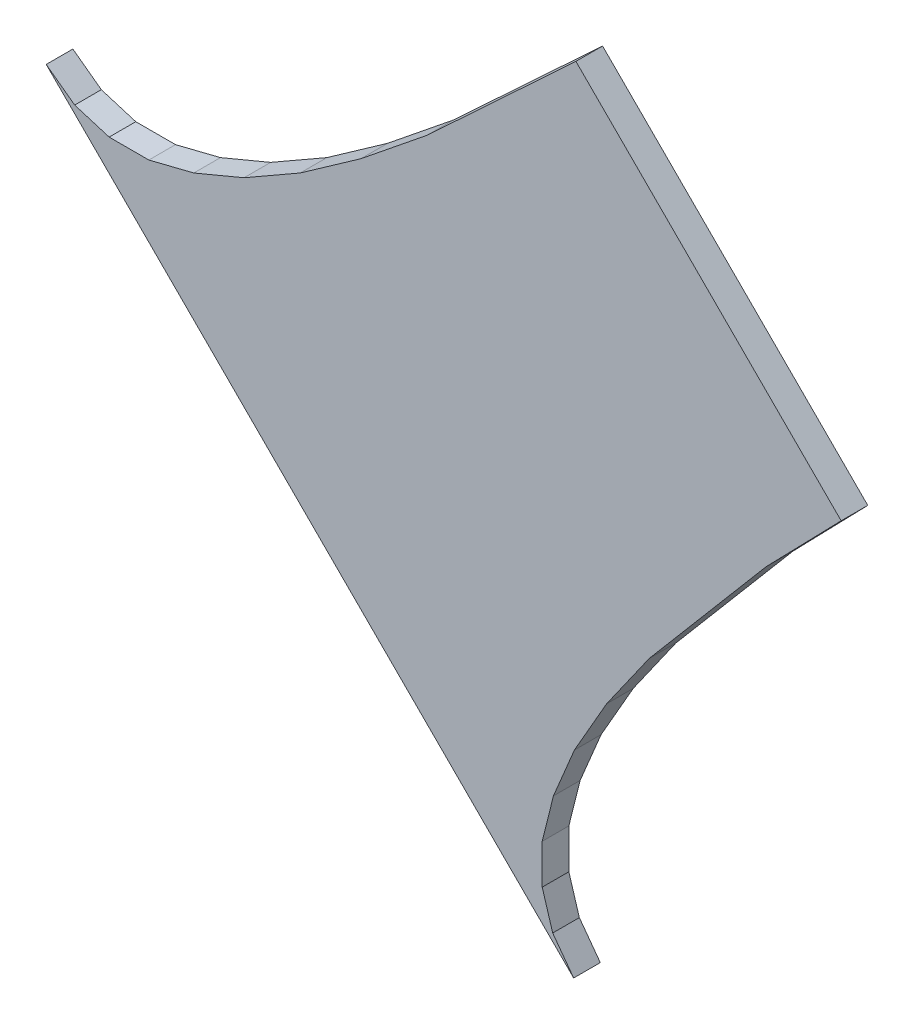
ISO-10303-21;
HEADER;
FILE_DESCRIPTION(('STEP AP214'),'2;1');
FILE_NAME('part.step','',(''),(''),'','','');
FILE_SCHEMA(('AUTOMOTIVE_DESIGN { 1 0 10303 214 1 1 1 1 }'));
ENDSEC;
DATA;
#1=APPLICATION_CONTEXT('core data for automotive mechanical design processes');
#2=APPLICATION_PROTOCOL_DEFINITION('international standard','automotive_design',2000,#1);
#3=PRODUCT_CONTEXT('',#1,'mechanical');
#4=PRODUCT('Part','Part','',(#3));
#5=PRODUCT_RELATED_PRODUCT_CATEGORY('part','',(#4));
#6=PRODUCT_DEFINITION_FORMATION('','',#4);
#7=PRODUCT_DEFINITION_CONTEXT('part definition',#1,'design');
#8=PRODUCT_DEFINITION('design','',#6,#7);
#9=PRODUCT_DEFINITION_SHAPE('','',#8);
#10=(LENGTH_UNIT() NAMED_UNIT(*) SI_UNIT(.MILLI.,.METRE.));
#11=(NAMED_UNIT(*) PLANE_ANGLE_UNIT() SI_UNIT($,.RADIAN.));
#12=(NAMED_UNIT(*) SI_UNIT($,.STERADIAN.) SOLID_ANGLE_UNIT());
#13=UNCERTAINTY_MEASURE_WITH_UNIT(LENGTH_MEASURE(1.E-05),#10,'distance_accuracy_value','');
#14=(GEOMETRIC_REPRESENTATION_CONTEXT(3) GLOBAL_UNCERTAINTY_ASSIGNED_CONTEXT((#13)) GLOBAL_UNIT_ASSIGNED_CONTEXT((#10,
#11,#12)) REPRESENTATION_CONTEXT('',''));
#15=CARTESIAN_POINT('',(0.,0.,0.));
#16=DIRECTION('',(0.,0.,1.));
#17=DIRECTION('',(1.,0.,0.));
#18=AXIS2_PLACEMENT_3D('',#15,#16,#17);
#19=CARTESIAN_POINT('',(40.2470016479492,102.280998229981,0.));
#20=DIRECTION('',(0.680867255825872,-0.732406840454229,0.));
#21=DIRECTION('',(-0.732406840454229,-0.680867255825872,0.));
#22=AXIS2_PLACEMENT_3D('',#19,#20,#21);
#23=PLANE('',#22);
#24=DIRECTION('',(-0.732406840454229,-0.680867255825872,0.));
#25=VECTOR('',#24,1.);
#26=CARTESIAN_POINT('',(40.2470016479492,102.280998229981,0.03556));
#27=LINE('',#26,#25);
#28=CARTESIAN_POINT('',(40.2470016479492,102.280998229981,0.03556));
#29=VERTEX_POINT('',#28);
#30=CARTESIAN_POINT('',(40.0480003356934,102.096000671387,0.03556));
#31=VERTEX_POINT('',#30);
#32=EDGE_CURVE('E11',#29,#31,#27,.T.);
#33=ORIENTED_EDGE('',*,*,#32,.F.);
#34=DIRECTION('',(0.,0.,1.));
#35=VECTOR('',#34,1.);
#36=CARTESIAN_POINT('',(40.2470016479492,102.280998229981,0.));
#37=LINE('',#36,#35);
#38=CARTESIAN_POINT('',(40.2470016479492,102.280998229981,0.));
#39=VERTEX_POINT('',#38);
#40=EDGE_CURVE('E24',#39,#29,#37,.T.);
#41=ORIENTED_EDGE('',*,*,#40,.F.);
#42=DIRECTION('',(-0.732406840454229,-0.680867255825872,0.));
#43=VECTOR('',#42,1.);
#44=CARTESIAN_POINT('',(40.2470016479492,102.280998229981,0.));
#45=LINE('',#44,#43);
#46=CARTESIAN_POINT('',(40.0480003356934,102.096000671387,0.));
#47=VERTEX_POINT('',#46);
#48=EDGE_CURVE('E172',#39,#47,#45,.T.);
#49=ORIENTED_EDGE('',*,*,#48,.T.);
#50=DIRECTION('',(0.,0.,1.));
#51=VECTOR('',#50,1.);
#52=CARTESIAN_POINT('',(40.0480003356934,102.096000671387,0.));
#53=LINE('',#52,#51);
#54=EDGE_CURVE('E37',#47,#31,#53,.T.);
#55=ORIENTED_EDGE('',*,*,#54,.T.);
#56=EDGE_LOOP('',(#33,#41,#49,#55));
#57=FACE_BOUND('',#56,.T.);
#58=ADVANCED_FACE('F17',(#57),#23,.F.);
#59=CARTESIAN_POINT('',(40.0480003356934,102.096000671387,0.));
#60=DIRECTION('',(0.627915315848081,-0.778281668885632,0.));
#61=DIRECTION('',(-0.778281668885632,-0.627915315848081,0.));
#62=AXIS2_PLACEMENT_3D('',#59,#60,#61);
#63=PLANE('',#62);
#64=DIRECTION('',(-0.778281668885632,-0.627915315848081,0.));
#65=VECTOR('',#64,1.);
#66=CARTESIAN_POINT('',(40.0480003356934,102.096000671387,0.03556));
#67=LINE('',#66,#65);
#68=CARTESIAN_POINT('',(39.9599990844727,102.025001525879,0.03556));
#69=VERTEX_POINT('',#68);
#70=EDGE_CURVE('E308',#31,#69,#67,.T.);
#71=ORIENTED_EDGE('',*,*,#70,.F.);
#72=ORIENTED_EDGE('',*,*,#54,.F.);
#73=DIRECTION('',(-0.778281668885632,-0.627915315848081,0.));
#74=VECTOR('',#73,1.);
#75=CARTESIAN_POINT('',(40.0480003356934,102.096000671387,0.));
#76=LINE('',#75,#74);
#77=CARTESIAN_POINT('',(39.9599990844727,102.025001525879,0.));
#78=VERTEX_POINT('',#77);
#79=EDGE_CURVE('E305',#47,#78,#76,.T.);
#80=ORIENTED_EDGE('',*,*,#79,.T.);
#81=DIRECTION('',(0.,0.,1.));
#82=VECTOR('',#81,1.);
#83=CARTESIAN_POINT('',(39.9599990844727,102.025001525879,0.));
#84=LINE('',#83,#82);
#85=EDGE_CURVE('E303',#78,#69,#84,.T.);
#86=ORIENTED_EDGE('',*,*,#85,.T.);
#87=EDGE_LOOP('',(#71,#72,#80,#86));
#88=FACE_BOUND('',#87,.T.);
#89=ADVANCED_FACE('F316',(#88),#63,.F.);
#90=CARTESIAN_POINT('',(39.9599990844727,102.025001525879,0.));
#91=DIRECTION('',(0.575500084548328,-0.817801719663677,0.));
#92=DIRECTION('',(-0.817801719663677,-0.575500084548328,0.));
#93=AXIS2_PLACEMENT_3D('',#90,#91,#92);
#94=PLANE('',#93);
#95=DIRECTION('',(-0.817801719663677,-0.575500084548328,0.));
#96=VECTOR('',#95,1.);
#97=CARTESIAN_POINT('',(39.9599990844727,102.025001525879,0.03556));
#98=LINE('',#97,#96);
#99=CARTESIAN_POINT('',(39.8790016174316,101.968002319336,0.03556));
#100=VERTEX_POINT('',#99);
#101=EDGE_CURVE('E300',#69,#100,#98,.T.);
#102=ORIENTED_EDGE('',*,*,#101,.F.);
#103=ORIENTED_EDGE('',*,*,#85,.F.);
#104=DIRECTION('',(-0.817801719663677,-0.575500084548328,0.));
#105=VECTOR('',#104,1.);
#106=CARTESIAN_POINT('',(39.9599990844727,102.025001525879,0.));
#107=LINE('',#106,#105);
#108=CARTESIAN_POINT('',(39.8790016174316,101.968002319336,0.));
#109=VERTEX_POINT('',#108);
#110=EDGE_CURVE('E297',#78,#109,#107,.T.);
#111=ORIENTED_EDGE('',*,*,#110,.T.);
#112=DIRECTION('',(0.,0.,1.));
#113=VECTOR('',#112,1.);
#114=CARTESIAN_POINT('',(39.8790016174316,101.968002319336,0.));
#115=LINE('',#114,#113);
#116=EDGE_CURVE('E295',#109,#100,#115,.T.);
#117=ORIENTED_EDGE('',*,*,#116,.T.);
#118=EDGE_LOOP('',(#102,#103,#111,#117));
#119=FACE_BOUND('',#118,.T.);
#120=ADVANCED_FACE('F322',(#119),#94,.F.);
#121=CARTESIAN_POINT('',(39.8790016174317,101.968002319336,0.));
#122=DIRECTION('',(0.49737392841794,-0.867536267443676,0.));
#123=DIRECTION('',(-0.867536267443676,-0.49737392841794,0.));
#124=AXIS2_PLACEMENT_3D('',#121,#122,#123);
#125=PLANE('',#124);
#126=DIRECTION('',(-0.867536267443676,-0.49737392841794,0.));
#127=VECTOR('',#126,1.);
#128=CARTESIAN_POINT('',(39.8790016174316,101.968002319336,0.03556));
#129=LINE('',#128,#127);
#130=CARTESIAN_POINT('',(39.8040008544922,101.925003051758,0.03556));
#131=VERTEX_POINT('',#130);
#132=EDGE_CURVE('E292',#100,#131,#129,.T.);
#133=ORIENTED_EDGE('',*,*,#132,.F.);
#134=ORIENTED_EDGE('',*,*,#116,.F.);
#135=DIRECTION('',(-0.867536267443676,-0.49737392841794,0.));
#136=VECTOR('',#135,1.);
#137=CARTESIAN_POINT('',(39.8790016174316,101.968002319336,0.));
#138=LINE('',#137,#136);
#139=CARTESIAN_POINT('',(39.8040008544922,101.925003051758,0.));
#140=VERTEX_POINT('',#139);
#141=EDGE_CURVE('E289',#109,#140,#138,.T.);
#142=ORIENTED_EDGE('',*,*,#141,.T.);
#143=DIRECTION('',(0.,0.,1.));
#144=VECTOR('',#143,1.);
#145=CARTESIAN_POINT('',(39.8040008544922,101.925003051758,0.));
#146=LINE('',#145,#144);
#147=EDGE_CURVE('E287',#140,#131,#146,.T.);
#148=ORIENTED_EDGE('',*,*,#147,.T.);
#149=EDGE_LOOP('',(#133,#134,#142,#148));
#150=FACE_BOUND('',#149,.T.);
#151=ADVANCED_FACE('F324',(#150),#125,.F.);
#152=CARTESIAN_POINT('',(39.8040008544922,101.925003051758,0.));
#153=DIRECTION('',(0.385584994163033,-0.922672321182495,0.));
#154=DIRECTION('',(-0.922672321182495,-0.385584994163033,0.));
#155=AXIS2_PLACEMENT_3D('',#152,#153,#154);
#156=PLANE('',#155);
#157=DIRECTION('',(-0.922672321182495,-0.385584994163033,0.));
#158=VECTOR('',#157,1.);
#159=CARTESIAN_POINT('',(39.8040008544922,101.925003051758,0.03556));
#160=LINE('',#159,#158);
#161=CARTESIAN_POINT('',(39.7369995117188,101.897003173828,0.03556));
#162=VERTEX_POINT('',#161);
#163=EDGE_CURVE('E284',#131,#162,#160,.T.);
#164=ORIENTED_EDGE('',*,*,#163,.F.);
#165=ORIENTED_EDGE('',*,*,#147,.F.);
#166=DIRECTION('',(-0.922672321182495,-0.385584994163033,0.));
#167=VECTOR('',#166,1.);
#168=CARTESIAN_POINT('',(39.8040008544922,101.925003051758,0.));
#169=LINE('',#168,#167);
#170=CARTESIAN_POINT('',(39.7369995117188,101.897003173828,0.));
#171=VERTEX_POINT('',#170);
#172=EDGE_CURVE('E281',#140,#171,#169,.T.);
#173=ORIENTED_EDGE('',*,*,#172,.T.);
#174=DIRECTION('',(0.,0.,1.));
#175=VECTOR('',#174,1.);
#176=CARTESIAN_POINT('',(39.7369995117188,101.897003173828,0.));
#177=LINE('',#176,#175);
#178=EDGE_CURVE('E279',#171,#162,#177,.T.);
#179=ORIENTED_EDGE('',*,*,#178,.T.);
#180=EDGE_LOOP('',(#164,#165,#173,#179));
#181=FACE_BOUND('',#180,.T.);
#182=ADVANCED_FACE('F329',(#181),#156,.F.);
#183=CARTESIAN_POINT('',(39.7369995117188,101.897003173828,0.));
#184=DIRECTION('',(0.242521112346139,-0.970146128202546,0.));
#185=DIRECTION('',(-0.970146128202546,-0.242521112346139,0.));
#186=AXIS2_PLACEMENT_3D('',#183,#184,#185);
#187=PLANE('',#186);
#188=DIRECTION('',(-0.970146128202546,-0.242521112346139,0.));
#189=VECTOR('',#188,1.);
#190=CARTESIAN_POINT('',(39.7369995117188,101.897003173828,0.03556));
#191=LINE('',#190,#189);
#192=CARTESIAN_POINT('',(39.6769981384277,101.88200378418,0.03556));
#193=VERTEX_POINT('',#192);
#194=EDGE_CURVE('E276',#162,#193,#191,.T.);
#195=ORIENTED_EDGE('',*,*,#194,.F.);
#196=ORIENTED_EDGE('',*,*,#178,.F.);
#197=DIRECTION('',(-0.970146128202546,-0.242521112346139,0.));
#198=VECTOR('',#197,1.);
#199=CARTESIAN_POINT('',(39.7369995117188,101.897003173828,0.));
#200=LINE('',#199,#198);
#201=CARTESIAN_POINT('',(39.6769981384277,101.88200378418,0.));
#202=VERTEX_POINT('',#201);
#203=EDGE_CURVE('E273',#171,#202,#200,.T.);
#204=ORIENTED_EDGE('',*,*,#203,.T.);
#205=DIRECTION('',(0.,0.,1.));
#206=VECTOR('',#205,1.);
#207=CARTESIAN_POINT('',(39.6769981384277,101.88200378418,0.));
#208=LINE('',#207,#206);
#209=EDGE_CURVE('E271',#202,#193,#208,.T.);
#210=ORIENTED_EDGE('',*,*,#209,.T.);
#211=EDGE_LOOP('',(#195,#196,#204,#210));
#212=FACE_BOUND('',#211,.T.);
#213=ADVANCED_FACE('F332',(#212),#187,.F.);
#214=CARTESIAN_POINT('',(39.6769981384277,101.88200378418,0.));
#215=DIRECTION('',(0.,-1.,0.));
#216=DIRECTION('',(-1.,0.,0.));
#217=AXIS2_PLACEMENT_3D('',#214,#215,#216);
#218=PLANE('',#217);
#219=DIRECTION('',(-1.,0.,0.));
#220=VECTOR('',#219,1.);
#221=CARTESIAN_POINT('',(39.6769981384277,101.88200378418,0.03556));
#222=LINE('',#221,#220);
#223=CARTESIAN_POINT('',(39.6240005493164,101.88200378418,0.03556));
#224=VERTEX_POINT('',#223);
#225=EDGE_CURVE('E268',#193,#224,#222,.T.);
#226=ORIENTED_EDGE('',*,*,#225,.F.);
#227=ORIENTED_EDGE('',*,*,#209,.F.);
#228=DIRECTION('',(-1.,0.,0.));
#229=VECTOR('',#228,1.);
#230=CARTESIAN_POINT('',(39.6769981384277,101.88200378418,0.));
#231=LINE('',#230,#229);
#232=CARTESIAN_POINT('',(39.6240005493164,101.88200378418,0.));
#233=VERTEX_POINT('',#232);
#234=EDGE_CURVE('E265',#202,#233,#231,.T.);
#235=ORIENTED_EDGE('',*,*,#234,.T.);
#236=DIRECTION('',(0.,0.,1.));
#237=VECTOR('',#236,1.);
#238=CARTESIAN_POINT('',(39.6240005493164,101.88200378418,0.));
#239=LINE('',#238,#237);
#240=EDGE_CURVE('E263',#233,#224,#239,.T.);
#241=ORIENTED_EDGE('',*,*,#240,.T.);
#242=EDGE_LOOP('',(#226,#227,#235,#241));
#243=FACE_BOUND('',#242,.T.);
#244=ADVANCED_FACE('F337',(#243),#218,.F.);
#245=CARTESIAN_POINT('',(39.6240005493164,101.88200378418,0.));
#246=DIRECTION('',(-0.291152145218841,-0.956676762723161,0.));
#247=DIRECTION('',(-0.956676762723161,0.291152145218841,0.));
#248=AXIS2_PLACEMENT_3D('',#245,#246,#247);
#249=PLANE('',#248);
#250=DIRECTION('',(-0.956676762723161,0.291152145218841,0.));
#251=VECTOR('',#250,1.);
#252=CARTESIAN_POINT('',(39.6240005493164,101.88200378418,0.03556));
#253=LINE('',#252,#251);
#254=CARTESIAN_POINT('',(39.5779991149902,101.896003723145,0.03556));
#255=VERTEX_POINT('',#254);
#256=EDGE_CURVE('E260',#224,#255,#253,.T.);
#257=ORIENTED_EDGE('',*,*,#256,.F.);
#258=ORIENTED_EDGE('',*,*,#240,.F.);
#259=DIRECTION('',(-0.956676762723161,0.291152145218841,0.));
#260=VECTOR('',#259,1.);
#261=CARTESIAN_POINT('',(39.6240005493164,101.88200378418,0.));
#262=LINE('',#261,#260);
#263=CARTESIAN_POINT('',(39.5779991149902,101.896003723145,0.));
#264=VERTEX_POINT('',#263);
#265=EDGE_CURVE('E257',#233,#264,#262,.T.);
#266=ORIENTED_EDGE('',*,*,#265,.T.);
#267=DIRECTION('',(0.,0.,1.));
#268=VECTOR('',#267,1.);
#269=CARTESIAN_POINT('',(39.5779991149902,101.896003723145,0.));
#270=LINE('',#269,#268);
#271=EDGE_CURVE('E255',#264,#255,#270,.T.);
#272=ORIENTED_EDGE('',*,*,#271,.T.);
#273=EDGE_LOOP('',(#257,#258,#266,#272));
#274=FACE_BOUND('',#273,.T.);
#275=ADVANCED_FACE('F340',(#274),#249,.F.);
#276=CARTESIAN_POINT('',(39.5779991149902,101.896003723145,0.));
#277=DIRECTION('',(-0.593215579091558,-0.805043648955178,0.));
#278=DIRECTION('',(-0.805043648955178,0.593215579091558,0.));
#279=AXIS2_PLACEMENT_3D('',#276,#277,#278);
#280=PLANE('',#279);
#281=DIRECTION('',(-0.805043648955178,0.593215579091558,0.));
#282=VECTOR('',#281,1.);
#283=CARTESIAN_POINT('',(39.5779991149902,101.896003723145,0.03556));
#284=LINE('',#283,#282);
#285=CARTESIAN_POINT('',(39.5400009155273,101.924003601074,0.03556));
#286=VERTEX_POINT('',#285);
#287=EDGE_CURVE('E252',#255,#286,#284,.T.);
#288=ORIENTED_EDGE('',*,*,#287,.F.);
#289=ORIENTED_EDGE('',*,*,#271,.F.);
#290=DIRECTION('',(-0.805043648955178,0.593215579091558,0.));
#291=VECTOR('',#290,1.);
#292=CARTESIAN_POINT('',(39.5779991149902,101.896003723145,0.));
#293=LINE('',#292,#291);
#294=CARTESIAN_POINT('',(39.5400009155273,101.924003601074,0.));
#295=VERTEX_POINT('',#294);
#296=EDGE_CURVE('E249',#264,#295,#293,.T.);
#297=ORIENTED_EDGE('',*,*,#296,.T.);
#298=DIRECTION('',(0.,0.,1.));
#299=VECTOR('',#298,1.);
#300=CARTESIAN_POINT('',(39.5400009155273,101.924003601074,0.));
#301=LINE('',#300,#299);
#302=EDGE_CURVE('E247',#295,#286,#301,.T.);
#303=ORIENTED_EDGE('',*,*,#302,.T.);
#304=EDGE_LOOP('',(#288,#289,#297,#303));
#305=FACE_BOUND('',#304,.T.);
#306=ADVANCED_FACE('F345',(#305),#280,.F.);
#307=CARTESIAN_POINT('',(39.5400009155273,101.924003601074,0.));
#308=DIRECTION('',(0.707108696948507,0.707104865419398,0.));
#309=DIRECTION('',(0.707104865419398,-0.707108696948507,0.));
#310=AXIS2_PLACEMENT_3D('',#307,#308,#309);
#311=PLANE('',#310);
#312=DIRECTION('',(0.707104865419398,-0.707108696948507,0.));
#313=VECTOR('',#312,1.);
#314=CARTESIAN_POINT('',(39.5400009155273,101.924003601074,0.03556));
#315=LINE('',#314,#313);
#316=CARTESIAN_POINT('',(40.2439994812012,101.220001220703,0.03556));
#317=VERTEX_POINT('',#316);
#318=EDGE_CURVE('E244',#286,#317,#315,.T.);
#319=ORIENTED_EDGE('',*,*,#318,.F.);
#320=ORIENTED_EDGE('',*,*,#302,.F.);
#321=DIRECTION('',(0.707104865419398,-0.707108696948507,0.));
#322=VECTOR('',#321,1.);
#323=CARTESIAN_POINT('',(39.5400009155273,101.924003601074,0.));
#324=LINE('',#323,#322);
#325=CARTESIAN_POINT('',(40.2439994812012,101.220001220703,0.));
#326=VERTEX_POINT('',#325);
#327=EDGE_CURVE('E241',#295,#326,#324,.T.);
#328=ORIENTED_EDGE('',*,*,#327,.T.);
#329=DIRECTION('',(0.,0.,1.));
#330=VECTOR('',#329,1.);
#331=CARTESIAN_POINT('',(40.2439994812012,101.220001220703,0.));
#332=LINE('',#331,#330);
#333=EDGE_CURVE('E239',#326,#317,#332,.T.);
#334=ORIENTED_EDGE('',*,*,#333,.T.);
#335=EDGE_LOOP('',(#319,#320,#328,#334));
#336=FACE_BOUND('',#335,.T.);
#337=ADVANCED_FACE('F348',(#336),#311,.F.);
#338=CARTESIAN_POINT('',(40.2439994812012,101.220001220703,0.));
#339=DIRECTION('',(-0.805072086965024,-0.593176984372945,0.));
#340=DIRECTION('',(-0.593176984372945,0.805072086965024,0.));
#341=AXIS2_PLACEMENT_3D('',#338,#339,#340);
#342=PLANE('',#341);
#343=DIRECTION('',(-0.593176984372945,0.805072086965024,0.));
#344=VECTOR('',#343,1.);
#345=CARTESIAN_POINT('',(40.2439994812012,101.220001220703,0.03556));
#346=LINE('',#345,#344);
#347=CARTESIAN_POINT('',(40.2159996032715,101.258003234863,0.03556));
#348=VERTEX_POINT('',#347);
#349=EDGE_CURVE('E236',#317,#348,#346,.T.);
#350=ORIENTED_EDGE('',*,*,#349,.F.);
#351=ORIENTED_EDGE('',*,*,#333,.F.);
#352=DIRECTION('',(-0.593176984372945,0.805072086965024,0.));
#353=VECTOR('',#352,1.);
#354=CARTESIAN_POINT('',(40.2439994812012,101.220001220703,0.));
#355=LINE('',#354,#353);
#356=CARTESIAN_POINT('',(40.2159996032715,101.258003234863,0.));
#357=VERTEX_POINT('',#356);
#358=EDGE_CURVE('E233',#326,#357,#355,.T.);
#359=ORIENTED_EDGE('',*,*,#358,.T.);
#360=DIRECTION('',(0.,0.,1.));
#361=VECTOR('',#360,1.);
#362=CARTESIAN_POINT('',(40.2159996032715,101.258003234863,0.));
#363=LINE('',#362,#361);
#364=EDGE_CURVE('E231',#357,#348,#363,.T.);
#365=ORIENTED_EDGE('',*,*,#364,.T.);
#366=EDGE_LOOP('',(#350,#351,#359,#365));
#367=FACE_BOUND('',#366,.T.);
#368=ADVANCED_FACE('F353',(#367),#342,.F.);
#369=CARTESIAN_POINT('',(40.2159996032715,101.258003234863,0.));
#370=DIRECTION('',(-0.956670036932239,-0.291174244115219,0.));
#371=DIRECTION('',(-0.291174244115219,0.956670036932239,0.));
#372=AXIS2_PLACEMENT_3D('',#369,#370,#371);
#373=PLANE('',#372);
#374=DIRECTION('',(-0.291174244115219,0.956670036932239,0.));
#375=VECTOR('',#374,1.);
#376=CARTESIAN_POINT('',(40.2159996032715,101.258003234863,0.03556));
#377=LINE('',#376,#375);
#378=CARTESIAN_POINT('',(40.2019996643066,101.304000854492,0.03556));
#379=VERTEX_POINT('',#378);
#380=EDGE_CURVE('E228',#348,#379,#377,.T.);
#381=ORIENTED_EDGE('',*,*,#380,.F.);
#382=ORIENTED_EDGE('',*,*,#364,.F.);
#383=DIRECTION('',(-0.291174244115219,0.956670036932239,0.));
#384=VECTOR('',#383,1.);
#385=CARTESIAN_POINT('',(40.2159996032715,101.258003234863,0.));
#386=LINE('',#385,#384);
#387=CARTESIAN_POINT('',(40.2019996643066,101.304000854492,0.));
#388=VERTEX_POINT('',#387);
#389=EDGE_CURVE('E225',#357,#388,#386,.T.);
#390=ORIENTED_EDGE('',*,*,#389,.T.);
#391=DIRECTION('',(0.,0.,1.));
#392=VECTOR('',#391,1.);
#393=CARTESIAN_POINT('',(40.2019996643066,101.304000854492,0.));
#394=LINE('',#393,#392);
#395=EDGE_CURVE('E223',#388,#379,#394,.T.);
#396=ORIENTED_EDGE('',*,*,#395,.T.);
#397=EDGE_LOOP('',(#381,#382,#390,#396));
#398=FACE_BOUND('',#397,.T.);
#399=ADVANCED_FACE('F356',(#398),#373,.F.);
#400=CARTESIAN_POINT('',(40.2019996643066,101.304000854492,0.));
#401=DIRECTION('',(-1.,0.,0.));
#402=DIRECTION('',(0.,1.,0.));
#403=AXIS2_PLACEMENT_3D('',#400,#401,#402);
#404=PLANE('',#403);
#405=DIRECTION('',(0.,1.,0.));
#406=VECTOR('',#405,1.);
#407=CARTESIAN_POINT('',(40.2019996643066,101.304000854492,0.03556));
#408=LINE('',#407,#406);
#409=CARTESIAN_POINT('',(40.2019996643066,101.357002258301,0.03556));
#410=VERTEX_POINT('',#409);
#411=EDGE_CURVE('E220',#379,#410,#408,.T.);
#412=ORIENTED_EDGE('',*,*,#411,.F.);
#413=ORIENTED_EDGE('',*,*,#395,.F.);
#414=DIRECTION('',(0.,1.,0.));
#415=VECTOR('',#414,1.);
#416=CARTESIAN_POINT('',(40.2019996643066,101.304000854492,0.));
#417=LINE('',#416,#415);
#418=CARTESIAN_POINT('',(40.2019996643066,101.357002258301,0.));
#419=VERTEX_POINT('',#418);
#420=EDGE_CURVE('E217',#388,#419,#417,.T.);
#421=ORIENTED_EDGE('',*,*,#420,.T.);
#422=DIRECTION('',(0.,0.,1.));
#423=VECTOR('',#422,1.);
#424=CARTESIAN_POINT('',(40.2019996643066,101.357002258301,0.));
#425=LINE('',#424,#423);
#426=EDGE_CURVE('E215',#419,#410,#425,.T.);
#427=ORIENTED_EDGE('',*,*,#426,.T.);
#428=EDGE_LOOP('',(#412,#413,#421,#427));
#429=FACE_BOUND('',#428,.T.);
#430=ADVANCED_FACE('F361',(#429),#404,.F.);
#431=CARTESIAN_POINT('',(40.2019996643066,101.357002258301,0.));
#432=DIRECTION('',(-0.970142500145332,0.242535625036333,0.));
#433=DIRECTION('',(0.242535625036333,0.970142500145332,0.));
#434=AXIS2_PLACEMENT_3D('',#431,#432,#433);
#435=PLANE('',#434);
#436=DIRECTION('',(0.242535625036333,0.970142500145332,0.));
#437=VECTOR('',#436,1.);
#438=CARTESIAN_POINT('',(40.2019996643066,101.357002258301,0.03556));
#439=LINE('',#438,#437);
#440=CARTESIAN_POINT('',(40.2169990539551,101.416999816895,0.03556));
#441=VERTEX_POINT('',#440);
#442=EDGE_CURVE('E212',#410,#441,#439,.T.);
#443=ORIENTED_EDGE('',*,*,#442,.F.);
#444=ORIENTED_EDGE('',*,*,#426,.F.);
#445=DIRECTION('',(0.242535625036333,0.970142500145332,0.));
#446=VECTOR('',#445,1.);
#447=CARTESIAN_POINT('',(40.2019996643066,101.357002258301,0.));
#448=LINE('',#447,#446);
#449=CARTESIAN_POINT('',(40.2169990539551,101.416999816895,0.));
#450=VERTEX_POINT('',#449);
#451=EDGE_CURVE('E209',#419,#450,#448,.T.);
#452=ORIENTED_EDGE('',*,*,#451,.T.);
#453=DIRECTION('',(0.,0.,1.));
#454=VECTOR('',#453,1.);
#455=CARTESIAN_POINT('',(40.2169990539551,101.416999816895,0.));
#456=LINE('',#455,#454);
#457=EDGE_CURVE('E207',#450,#441,#456,.T.);
#458=ORIENTED_EDGE('',*,*,#457,.T.);
#459=EDGE_LOOP('',(#443,#444,#452,#458));
#460=FACE_BOUND('',#459,.T.);
#461=ADVANCED_FACE('F364',(#460),#435,.F.);
#462=CARTESIAN_POINT('',(40.2169990539551,101.416999816895,0.));
#463=DIRECTION('',(-0.922672321182495,0.385584994163033,0.));
#464=DIRECTION('',(0.385584994163033,0.922672321182495,0.));
#465=AXIS2_PLACEMENT_3D('',#462,#463,#464);
#466=PLANE('',#465);
#467=DIRECTION('',(0.385584994163033,0.922672321182495,0.));
#468=VECTOR('',#467,1.);
#469=CARTESIAN_POINT('',(40.2169990539551,101.416999816895,0.03556));
#470=LINE('',#469,#468);
#471=CARTESIAN_POINT('',(40.2449989318848,101.484001159668,0.03556));
#472=VERTEX_POINT('',#471);
#473=EDGE_CURVE('E204',#441,#472,#470,.T.);
#474=ORIENTED_EDGE('',*,*,#473,.F.);
#475=ORIENTED_EDGE('',*,*,#457,.F.);
#476=DIRECTION('',(0.385584994163033,0.922672321182495,0.));
#477=VECTOR('',#476,1.);
#478=CARTESIAN_POINT('',(40.2169990539551,101.416999816895,0.));
#479=LINE('',#478,#477);
#480=CARTESIAN_POINT('',(40.2449989318848,101.484001159668,0.));
#481=VERTEX_POINT('',#480);
#482=EDGE_CURVE('E201',#450,#481,#479,.T.);
#483=ORIENTED_EDGE('',*,*,#482,.T.);
#484=DIRECTION('',(0.,0.,1.));
#485=VECTOR('',#484,1.);
#486=CARTESIAN_POINT('',(40.2449989318848,101.484001159668,0.));
#487=LINE('',#486,#485);
#488=EDGE_CURVE('E199',#481,#472,#487,.T.);
#489=ORIENTED_EDGE('',*,*,#488,.T.);
#490=EDGE_LOOP('',(#474,#475,#483,#489));
#491=FACE_BOUND('',#490,.T.);
#492=ADVANCED_FACE('F369',(#491),#466,.F.);
#493=CARTESIAN_POINT('',(40.2449989318848,101.484001159668,0.));
#494=DIRECTION('',(-0.867525351205398,0.497392968402199,0.));
#495=DIRECTION('',(0.497392968402199,0.867525351205398,0.));
#496=AXIS2_PLACEMENT_3D('',#493,#494,#495);
#497=PLANE('',#496);
#498=DIRECTION('',(0.497392968402199,0.867525351205398,0.));
#499=VECTOR('',#498,1.);
#500=CARTESIAN_POINT('',(40.2449989318848,101.484001159668,0.03556));
#501=LINE('',#500,#499);
#502=CARTESIAN_POINT('',(40.2879981994629,101.55899810791,0.03556));
#503=VERTEX_POINT('',#502);
#504=EDGE_CURVE('E196',#472,#503,#501,.T.);
#505=ORIENTED_EDGE('',*,*,#504,.F.);
#506=ORIENTED_EDGE('',*,*,#488,.F.);
#507=DIRECTION('',(0.497392968402199,0.867525351205398,0.));
#508=VECTOR('',#507,1.);
#509=CARTESIAN_POINT('',(40.2449989318848,101.484001159668,0.));
#510=LINE('',#509,#508);
#511=CARTESIAN_POINT('',(40.2879981994629,101.55899810791,0.));
#512=VERTEX_POINT('',#511);
#513=EDGE_CURVE('E193',#481,#512,#510,.T.);
#514=ORIENTED_EDGE('',*,*,#513,.T.);
#515=DIRECTION('',(0.,0.,1.));
#516=VECTOR('',#515,1.);
#517=CARTESIAN_POINT('',(40.2879981994629,101.55899810791,0.));
#518=LINE('',#517,#516);
#519=EDGE_CURVE('E191',#512,#503,#518,.T.);
#520=ORIENTED_EDGE('',*,*,#519,.T.);
#521=EDGE_LOOP('',(#505,#506,#514,#520));
#522=FACE_BOUND('',#521,.T.);
#523=ADVANCED_FACE('F372',(#522),#497,.F.);
#524=CARTESIAN_POINT('',(40.2879981994629,101.55899810791,0.));
#525=DIRECTION('',(-0.817796349123491,0.575507716160513,0.));
#526=DIRECTION('',(0.575507716160513,0.817796349123491,0.));
#527=AXIS2_PLACEMENT_3D('',#524,#525,#526);
#528=PLANE('',#527);
#529=DIRECTION('',(0.575507716160513,0.817796349123491,0.));
#530=VECTOR('',#529,1.);
#531=CARTESIAN_POINT('',(40.2879981994629,101.55899810791,0.03556));
#532=LINE('',#531,#530);
#533=CARTESIAN_POINT('',(40.3450012207031,101.639999389648,0.03556));
#534=VERTEX_POINT('',#533);
#535=EDGE_CURVE('E188',#503,#534,#532,.T.);
#536=ORIENTED_EDGE('',*,*,#535,.F.);
#537=ORIENTED_EDGE('',*,*,#519,.F.);
#538=DIRECTION('',(0.575507716160513,0.817796349123491,0.));
#539=VECTOR('',#538,1.);
#540=CARTESIAN_POINT('',(40.2879981994629,101.55899810791,0.));
#541=LINE('',#540,#539);
#542=CARTESIAN_POINT('',(40.3450012207031,101.639999389648,0.));
#543=VERTEX_POINT('',#542);
#544=EDGE_CURVE('E185',#512,#543,#541,.T.);
#545=ORIENTED_EDGE('',*,*,#544,.T.);
#546=DIRECTION('',(0.,0.,1.));
#547=VECTOR('',#546,1.);
#548=CARTESIAN_POINT('',(40.3450012207031,101.639999389648,0.));
#549=LINE('',#548,#547);
#550=EDGE_CURVE('E183',#543,#534,#549,.T.);
#551=ORIENTED_EDGE('',*,*,#550,.T.);
#552=EDGE_LOOP('',(#536,#537,#545,#551));
#553=FACE_BOUND('',#552,.T.);
#554=ADVANCED_FACE('F377',(#553),#528,.F.);
#555=CARTESIAN_POINT('',(40.3450012207031,101.639999389648,0.));
#556=DIRECTION('',(-0.762757302611209,0.646684851618833,0.));
#557=DIRECTION('',(0.646684851618833,0.762757302611209,0.));
#558=AXIS2_PLACEMENT_3D('',#555,#556,#557);
#559=PLANE('',#558);
#560=DIRECTION('',(0.646684851618833,0.762757302611209,0.));
#561=VECTOR('',#560,1.);
#562=CARTESIAN_POINT('',(40.3450012207031,101.639999389648,0.03556));
#563=LINE('',#562,#561);
#564=CARTESIAN_POINT('',(40.5009994506836,101.823997497559,0.03556));
#565=VERTEX_POINT('',#564);
#566=EDGE_CURVE('E180',#534,#565,#563,.T.);
#567=ORIENTED_EDGE('',*,*,#566,.F.);
#568=ORIENTED_EDGE('',*,*,#550,.F.);
#569=DIRECTION('',(0.646684851618833,0.762757302611209,0.));
#570=VECTOR('',#569,1.);
#571=CARTESIAN_POINT('',(40.3450012207031,101.639999389648,0.));
#572=LINE('',#571,#570);
#573=CARTESIAN_POINT('',(40.5009994506836,101.823997497559,0.));
#574=VERTEX_POINT('',#573);
#575=EDGE_CURVE('E178',#543,#574,#572,.T.);
#576=ORIENTED_EDGE('',*,*,#575,.T.);
#577=DIRECTION('',(0.,0.,1.));
#578=VECTOR('',#577,1.);
#579=CARTESIAN_POINT('',(40.5009994506836,101.823997497559,0.));
#580=LINE('',#579,#578);
#581=EDGE_CURVE('E163',#574,#565,#580,.T.);
#582=ORIENTED_EDGE('',*,*,#581,.T.);
#583=EDGE_LOOP('',(#567,#568,#576,#582));
#584=FACE_BOUND('',#583,.T.);
#585=ADVANCED_FACE('F379',(#584),#559,.F.);
#586=CARTESIAN_POINT('',(40.5009994506836,101.823997497559,0.));
#587=DIRECTION('',(-0.71748538235503,0.696573561159807,0.));
#588=DIRECTION('',(0.696573561159807,0.71748538235503,0.));
#589=AXIS2_PLACEMENT_3D('',#586,#587,#588);
#590=PLANE('',#589);
#591=DIRECTION('',(0.696573561159807,0.71748538235503,0.));
#592=VECTOR('',#591,1.);
#593=CARTESIAN_POINT('',(40.5009994506836,101.823997497559,0.03556));
#594=LINE('',#593,#592);
#595=CARTESIAN_POINT('',(40.601001739502,101.927001953125,0.03556));
#596=VERTEX_POINT('',#595);
#597=EDGE_CURVE('E167',#565,#596,#594,.T.);
#598=ORIENTED_EDGE('',*,*,#597,.F.);
#599=ORIENTED_EDGE('',*,*,#581,.F.);
#600=DIRECTION('',(0.696573561159807,0.71748538235503,0.));
#601=VECTOR('',#600,1.);
#602=CARTESIAN_POINT('',(40.5009994506836,101.823997497559,0.));
#603=LINE('',#602,#601);
#604=CARTESIAN_POINT('',(40.601001739502,101.927001953125,0.));
#605=VERTEX_POINT('',#604);
#606=EDGE_CURVE('E159',#574,#605,#603,.T.);
#607=ORIENTED_EDGE('',*,*,#606,.T.);
#608=DIRECTION('',(0.,0.,1.));
#609=VECTOR('',#608,1.);
#610=CARTESIAN_POINT('',(40.601001739502,101.927001953125,0.));
#611=LINE('',#610,#609);
#612=EDGE_CURVE('E149',#605,#596,#611,.T.);
#613=ORIENTED_EDGE('',*,*,#612,.T.);
#614=EDGE_LOOP('',(#598,#599,#607,#613));
#615=FACE_BOUND('',#614,.T.);
#616=ADVANCED_FACE('F162',(#615),#590,.F.);
#617=CARTESIAN_POINT('',(40.601001739502,101.927001953125,0.));
#618=DIRECTION('',(-0.70710297127213,-0.707110591080437,0.));
#619=DIRECTION('',(-0.707110591080437,0.70710297127213,0.));
#620=AXIS2_PLACEMENT_3D('',#617,#618,#619);
#621=PLANE('',#620);
#622=DIRECTION('',(-0.707110591080437,0.70710297127213,0.));
#623=VECTOR('',#622,1.);
#624=CARTESIAN_POINT('',(40.601001739502,101.927001953125,0.03556));
#625=LINE('',#624,#623);
#626=EDGE_CURVE('E155',#596,#29,#625,.T.);
#627=ORIENTED_EDGE('',*,*,#626,.F.);
#628=ORIENTED_EDGE('',*,*,#612,.F.);
#629=DIRECTION('',(-0.707110591080437,0.70710297127213,0.));
#630=VECTOR('',#629,1.);
#631=CARTESIAN_POINT('',(40.601001739502,101.927001953125,0.));
#632=LINE('',#631,#630);
#633=EDGE_CURVE('E153',#605,#39,#632,.T.);
#634=ORIENTED_EDGE('',*,*,#633,.T.);
#635=ORIENTED_EDGE('',*,*,#40,.T.);
#636=EDGE_LOOP('',(#627,#628,#634,#635));
#637=FACE_BOUND('',#636,.T.);
#638=ADVANCED_FACE('F151',(#637),#621,.F.);
#639=CARTESIAN_POINT('',(40.2470016479492,102.280998229981,0.));
#640=DIRECTION('',(0.,0.,1.));
#641=DIRECTION('',(1.,0.,0.));
#642=AXIS2_PLACEMENT_3D('',#639,#640,#641);
#643=PLANE('',#642);
#644=ORIENTED_EDGE('',*,*,#633,.F.);
#645=ORIENTED_EDGE('',*,*,#606,.F.);
#646=ORIENTED_EDGE('',*,*,#575,.F.);
#647=ORIENTED_EDGE('',*,*,#544,.F.);
#648=ORIENTED_EDGE('',*,*,#513,.F.);
#649=ORIENTED_EDGE('',*,*,#482,.F.);
#650=ORIENTED_EDGE('',*,*,#451,.F.);
#651=ORIENTED_EDGE('',*,*,#420,.F.);
#652=ORIENTED_EDGE('',*,*,#389,.F.);
#653=ORIENTED_EDGE('',*,*,#358,.F.);
#654=ORIENTED_EDGE('',*,*,#327,.F.);
#655=ORIENTED_EDGE('',*,*,#296,.F.);
#656=ORIENTED_EDGE('',*,*,#265,.F.);
#657=ORIENTED_EDGE('',*,*,#234,.F.);
#658=ORIENTED_EDGE('',*,*,#203,.F.);
#659=ORIENTED_EDGE('',*,*,#172,.F.);
#660=ORIENTED_EDGE('',*,*,#141,.F.);
#661=ORIENTED_EDGE('',*,*,#110,.F.);
#662=ORIENTED_EDGE('',*,*,#79,.F.);
#663=ORIENTED_EDGE('',*,*,#48,.F.);
#664=EDGE_LOOP('',(#644,#645,#646,#647,#648,#649,#650,#651,#652,#653,#654,#655,#656,#657,#658,
#659,#660,#661,#662,#663));
#665=FACE_BOUND('',#664,.T.);
#666=ADVANCED_FACE('F170',(#665),#643,.F.);
#667=CARTESIAN_POINT('',(40.2470016479492,102.280998229981,0.03556));
#668=DIRECTION('',(0.,0.,1.));
#669=DIRECTION('',(1.,0.,0.));
#670=AXIS2_PLACEMENT_3D('',#667,#668,#669);
#671=PLANE('',#670);
#672=ORIENTED_EDGE('',*,*,#32,.T.);
#673=ORIENTED_EDGE('',*,*,#70,.T.);
#674=ORIENTED_EDGE('',*,*,#101,.T.);
#675=ORIENTED_EDGE('',*,*,#132,.T.);
#676=ORIENTED_EDGE('',*,*,#163,.T.);
#677=ORIENTED_EDGE('',*,*,#194,.T.);
#678=ORIENTED_EDGE('',*,*,#225,.T.);
#679=ORIENTED_EDGE('',*,*,#256,.T.);
#680=ORIENTED_EDGE('',*,*,#287,.T.);
#681=ORIENTED_EDGE('',*,*,#318,.T.);
#682=ORIENTED_EDGE('',*,*,#349,.T.);
#683=ORIENTED_EDGE('',*,*,#380,.T.);
#684=ORIENTED_EDGE('',*,*,#411,.T.);
#685=ORIENTED_EDGE('',*,*,#442,.T.);
#686=ORIENTED_EDGE('',*,*,#473,.T.);
#687=ORIENTED_EDGE('',*,*,#504,.T.);
#688=ORIENTED_EDGE('',*,*,#535,.T.);
#689=ORIENTED_EDGE('',*,*,#566,.T.);
#690=ORIENTED_EDGE('',*,*,#597,.T.);
#691=ORIENTED_EDGE('',*,*,#626,.T.);
#692=EDGE_LOOP('',(#672,#673,#674,#675,#676,#677,#678,#679,#680,#681,#682,#683,#684,#685,#686,
#687,#688,#689,#690,#691));
#693=FACE_BOUND('',#692,.T.);
#694=ADVANCED_FACE('F319',(#693),#671,.T.);
#695=CLOSED_SHELL('',(#58,#89,#120,#151,#182,#213,#244,#275,#306,#337,#368,#399,#430,#461,#492,
#523,#554,#585,#616,#638,#666,#694));
#696=MANIFOLD_SOLID_BREP('B1',#695);
#697=ADVANCED_BREP_SHAPE_REPRESENTATION('',(#18,#696),#14);
#698=SHAPE_DEFINITION_REPRESENTATION(#9,#697);
ENDSEC;
END-ISO-10303-21;
